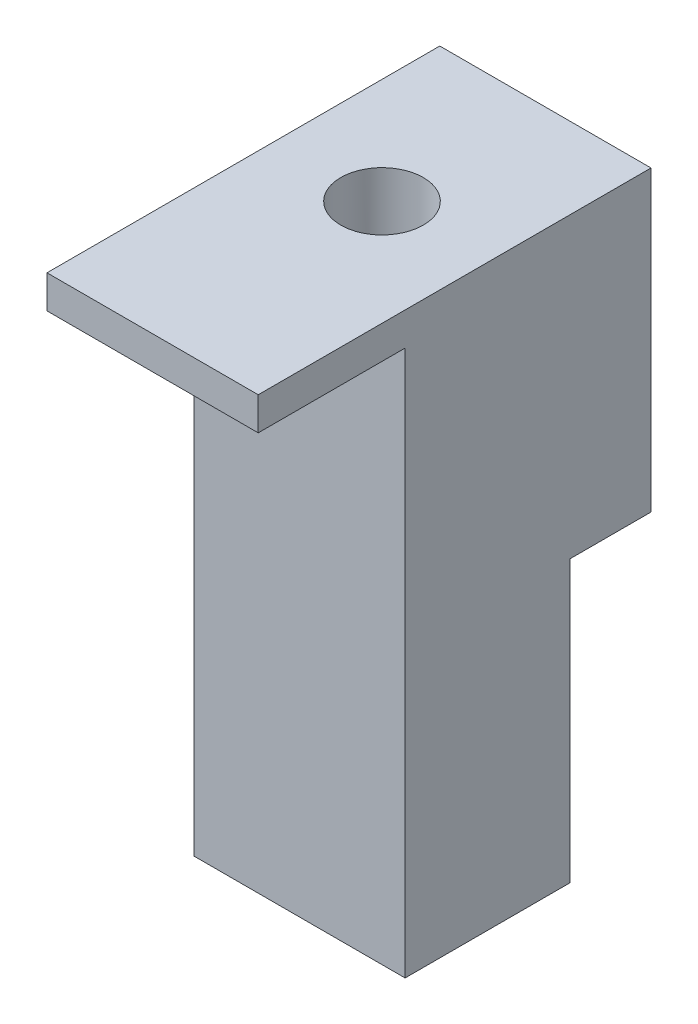
ISO-10303-21;
HEADER;
FILE_DESCRIPTION(('STEP AP214'),'2;1');
FILE_NAME('part.step','',(''),(''),'','','');
FILE_SCHEMA(('AUTOMOTIVE_DESIGN { 1 0 10303 214 1 1 1 1 }'));
ENDSEC;
DATA;
#1=APPLICATION_CONTEXT('core data for automotive mechanical design processes');
#2=APPLICATION_PROTOCOL_DEFINITION('international standard','automotive_design',2000,#1);
#3=PRODUCT_CONTEXT('',#1,'mechanical');
#4=PRODUCT('Part','Part','',(#3));
#5=PRODUCT_RELATED_PRODUCT_CATEGORY('part','',(#4));
#6=PRODUCT_DEFINITION_FORMATION('','',#4);
#7=PRODUCT_DEFINITION_CONTEXT('part definition',#1,'design');
#8=PRODUCT_DEFINITION('design','',#6,#7);
#9=PRODUCT_DEFINITION_SHAPE('','',#8);
#10=(LENGTH_UNIT() NAMED_UNIT(*) SI_UNIT(.MILLI.,.METRE.));
#11=(NAMED_UNIT(*) PLANE_ANGLE_UNIT() SI_UNIT($,.RADIAN.));
#12=(NAMED_UNIT(*) SI_UNIT($,.STERADIAN.) SOLID_ANGLE_UNIT());
#13=UNCERTAINTY_MEASURE_WITH_UNIT(LENGTH_MEASURE(1.E-05),#10,'distance_accuracy_value','');
#14=(GEOMETRIC_REPRESENTATION_CONTEXT(3) GLOBAL_UNCERTAINTY_ASSIGNED_CONTEXT((#13)) GLOBAL_UNIT_ASSIGNED_CONTEXT((#10,
#11,#12)) REPRESENTATION_CONTEXT('',''));
#15=CARTESIAN_POINT('',(0.,0.,0.));
#16=DIRECTION('',(0.,0.,1.));
#17=DIRECTION('',(1.,0.,0.));
#18=AXIS2_PLACEMENT_3D('',#15,#16,#17);
#19=CARTESIAN_POINT('',(138.75,12.9444271909998,15.));
#20=DIRECTION('',(0.,0.,1.));
#21=DIRECTION('',(1.,0.,0.));
#22=AXIS2_PLACEMENT_3D('',#19,#20,#21);
#23=PLANE('',#22);
#24=DIRECTION('',(-1.,0.,0.));
#25=VECTOR('',#24,1.);
#26=CARTESIAN_POINT('',(138.75,33.,15.));
#27=LINE('',#26,#25);
#28=CARTESIAN_POINT('',(138.65,33.,15.));
#29=VERTEX_POINT('',#28);
#30=CARTESIAN_POINT('',(125.85,33.,15.));
#31=VERTEX_POINT('',#30);
#32=EDGE_CURVE('E436',#29,#31,#27,.T.);
#33=ORIENTED_EDGE('',*,*,#32,.T.);
#34=DIRECTION('',(0.,1.,0.));
#35=VECTOR('',#34,1.);
#36=CARTESIAN_POINT('',(125.85,-2.00000000000001,15.));
#37=LINE('',#36,#35);
#38=CARTESIAN_POINT('',(125.85,-0.0555728090001692,15.));
#39=VERTEX_POINT('',#38);
#40=EDGE_CURVE('E237',#39,#31,#37,.T.);
#41=ORIENTED_EDGE('',*,*,#40,.F.);
#42=DIRECTION('',(-1.,0.,0.));
#43=VECTOR('',#42,1.);
#44=CARTESIAN_POINT('',(138.75,-0.0555728090001692,15.));
#45=LINE('',#44,#43);
#46=CARTESIAN_POINT('',(138.65,-0.0555728090001692,15.));
#47=VERTEX_POINT('',#46);
#48=EDGE_CURVE('E311',#47,#39,#45,.T.);
#49=ORIENTED_EDGE('',*,*,#48,.F.);
#50=DIRECTION('',(0.,1.,0.));
#51=VECTOR('',#50,1.);
#52=CARTESIAN_POINT('',(138.65,-2.00000000000001,15.));
#53=LINE('',#52,#51);
#54=EDGE_CURVE('E241',#47,#29,#53,.T.);
#55=ORIENTED_EDGE('',*,*,#54,.T.);
#56=EDGE_LOOP('',(#33,#41,#49,#55));
#57=FACE_BOUND('',#56,.T.);
#58=ADVANCED_FACE('F55',(#57),#23,.T.);
#59=CARTESIAN_POINT('',(132.25,12.9444271909998,10.));
#60=DIRECTION('',(0.,0.,-1.));
#61=DIRECTION('',(-1.,0.,0.));
#62=AXIS2_PLACEMENT_3D('',#59,#60,#61);
#63=CYLINDRICAL_SURFACE('',#62,6.50000000000001);
#64=CARTESIAN_POINT('',(132.25,12.9444271909998,0.0999999999999994));
#65=DIRECTION('',(0.,0.,-1.));
#66=DIRECTION('',(-1.,0.,0.));
#67=AXIS2_PLACEMENT_3D('',#64,#65,#66);
#68=CIRCLE('',#67,6.50000000000001);
#69=CARTESIAN_POINT('',(137.37347538298,16.9444271909998,0.0999999999999994));
#70=VERTEX_POINT('',#69);
#71=CARTESIAN_POINT('',(127.12652461702,16.9444271909998,0.1));
#72=VERTEX_POINT('',#71);
#73=EDGE_CURVE('E240',#70,#72,#68,.F.);
#74=ORIENTED_EDGE('',*,*,#73,.F.);
#75=DIRECTION('',(0.,0.,-1.));
#76=VECTOR('',#75,1.);
#77=CARTESIAN_POINT('',(137.37347538298,16.9444271909998,10.));
#78=LINE('',#77,#76);
#79=CARTESIAN_POINT('',(137.37347538298,16.9444271909998,5.));
#80=VERTEX_POINT('',#79);
#81=EDGE_CURVE('E291',#80,#70,#78,.T.);
#82=ORIENTED_EDGE('',*,*,#81,.F.);
#83=CARTESIAN_POINT('',(132.25,12.9444271909998,5.));
#84=DIRECTION('',(0.,0.,-1.));
#85=DIRECTION('',(-1.,0.,0.));
#86=AXIS2_PLACEMENT_3D('',#83,#84,#85);
#87=CIRCLE('',#86,6.50000000000001);
#88=CARTESIAN_POINT('',(127.12652461702,16.9444271909998,5.));
#89=VERTEX_POINT('',#88);
#90=EDGE_CURVE('E432',#80,#89,#87,.F.);
#91=ORIENTED_EDGE('',*,*,#90,.T.);
#92=DIRECTION('',(0.,0.,-1.));
#93=VECTOR('',#92,1.);
#94=CARTESIAN_POINT('',(127.12652461702,16.9444271909998,10.));
#95=LINE('',#94,#93);
#96=EDGE_CURVE('E295',#72,#89,#95,.F.);
#97=ORIENTED_EDGE('',*,*,#96,.F.);
#98=EDGE_LOOP('',(#74,#82,#91,#97));
#99=FACE_BOUND('',#98,.T.);
#100=ADVANCED_FACE('F481',(#99),#63,.F.);
#101=CARTESIAN_POINT('',(0.,12.9444271909998,5.));
#102=DIRECTION('',(0.,0.,-1.));
#103=DIRECTION('',(-1.,0.,0.));
#104=AXIS2_PLACEMENT_3D('',#101,#102,#103);
#105=PLANE('',#104);
#106=DIRECTION('',(1.,0.,0.));
#107=VECTOR('',#106,1.);
#108=CARTESIAN_POINT('',(125.75,-0.0555728090001692,5.));
#109=LINE('',#108,#107);
#110=CARTESIAN_POINT('',(125.85,-0.0555728090001692,5.));
#111=VERTEX_POINT('',#110);
#112=CARTESIAN_POINT('',(131.,-0.0555728090001692,5.));
#113=VERTEX_POINT('',#112);
#114=EDGE_CURVE('E315',#111,#113,#109,.T.);
#115=ORIENTED_EDGE('',*,*,#114,.F.);
#116=DIRECTION('',(0.,1.,0.));
#117=VECTOR('',#116,1.);
#118=CARTESIAN_POINT('',(125.85,12.9444271909998,5.));
#119=LINE('',#118,#117);
#120=CARTESIAN_POINT('',(125.85,16.9444271909998,5.));
#121=VERTEX_POINT('',#120);
#122=EDGE_CURVE('E252',#111,#121,#119,.T.);
#123=ORIENTED_EDGE('',*,*,#122,.T.);
#124=DIRECTION('',(1.,0.,0.));
#125=VECTOR('',#124,1.);
#126=CARTESIAN_POINT('',(0.,16.9444271909998,5.));
#127=LINE('',#126,#125);
#128=EDGE_CURVE('E288',#121,#89,#127,.T.);
#129=ORIENTED_EDGE('',*,*,#128,.T.);
#130=ORIENTED_EDGE('',*,*,#90,.F.);
#131=CARTESIAN_POINT('',(138.65,16.9444271909998,5.));
#132=VERTEX_POINT('',#131);
#133=EDGE_CURVE('E285',#80,#132,#127,.T.);
#134=ORIENTED_EDGE('',*,*,#133,.T.);
#135=DIRECTION('',(0.,-1.,0.));
#136=VECTOR('',#135,1.);
#137=CARTESIAN_POINT('',(138.65,12.9444271909998,5.));
#138=LINE('',#137,#136);
#139=CARTESIAN_POINT('',(138.65,-0.0555728090001692,5.));
#140=VERTEX_POINT('',#139);
#141=EDGE_CURVE('E260',#132,#140,#138,.T.);
#142=ORIENTED_EDGE('',*,*,#141,.T.);
#143=DIRECTION('',(1.,0.,0.));
#144=VECTOR('',#143,1.);
#145=CARTESIAN_POINT('',(133.5,-0.0555728090001692,5.));
#146=LINE('',#145,#144);
#147=CARTESIAN_POINT('',(133.5,-0.0555728090001692,5.));
#148=VERTEX_POINT('',#147);
#149=EDGE_CURVE('E307',#148,#140,#146,.T.);
#150=ORIENTED_EDGE('',*,*,#149,.F.);
#151=DIRECTION('',(0.,-1.,0.));
#152=VECTOR('',#151,1.);
#153=CARTESIAN_POINT('',(133.5,17.9444271909998,5.));
#154=LINE('',#153,#152);
#155=CARTESIAN_POINT('',(133.5,17.9444271909998,5.));
#156=VERTEX_POINT('',#155);
#157=EDGE_CURVE('E370',#156,#148,#154,.T.);
#158=ORIENTED_EDGE('',*,*,#157,.F.);
#159=DIRECTION('',(1.,0.,0.));
#160=VECTOR('',#159,1.);
#161=CARTESIAN_POINT('',(0.,17.9444271909998,5.));
#162=LINE('',#161,#160);
#163=CARTESIAN_POINT('',(131.,17.9444271909998,5.));
#164=VERTEX_POINT('',#163);
#165=EDGE_CURVE('E359',#164,#156,#162,.T.);
#166=ORIENTED_EDGE('',*,*,#165,.F.);
#167=DIRECTION('',(0.,-1.,0.));
#168=VECTOR('',#167,1.);
#169=CARTESIAN_POINT('',(131.,17.9444271909998,5.));
#170=LINE('',#169,#168);
#171=EDGE_CURVE('E373',#164,#113,#170,.T.);
#172=ORIENTED_EDGE('',*,*,#171,.T.);
#173=EDGE_LOOP('',(#115,#123,#129,#130,#134,#142,#150,#158,#166,#172));
#174=FACE_BOUND('',#173,.T.);
#175=ADVANCED_FACE('F448',(#174),#105,.T.);
#176=CARTESIAN_POINT('',(138.75,35.,10.));
#177=DIRECTION('',(0.,-1.,0.));
#178=DIRECTION('',(0.,0.,-1.));
#179=AXIS2_PLACEMENT_3D('',#176,#177,#178);
#180=PLANE('',#179);
#181=CARTESIAN_POINT('',(132.25,35.,10.));
#182=DIRECTION('',(0.,-1.,0.));
#183=DIRECTION('',(0.,0.,-1.));
#184=AXIS2_PLACEMENT_3D('',#181,#182,#183);
#185=CIRCLE('',#184,2.5);
#186=CARTESIAN_POINT('',(132.25,35.,7.50000000000001));
#187=VERTEX_POINT('',#186);
#188=EDGE_CURVE('E389',#187,#187,#185,.T.);
#189=ORIENTED_EDGE('',*,*,#188,.T.);
#190=EDGE_LOOP('',(#189));
#191=FACE_BOUND('',#190,.T.);
#192=DIRECTION('',(-1.,0.,0.));
#193=VECTOR('',#192,1.);
#194=CARTESIAN_POINT('',(0.,35.,0.1));
#195=LINE('',#194,#193);
#196=CARTESIAN_POINT('',(138.65,35.,0.1));
#197=VERTEX_POINT('',#196);
#198=CARTESIAN_POINT('',(125.85,35.,0.1));
#199=VERTEX_POINT('',#198);
#200=EDGE_CURVE('E226',#197,#199,#195,.T.);
#201=ORIENTED_EDGE('',*,*,#200,.T.);
#202=DIRECTION('',(0.,0.,1.));
#203=VECTOR('',#202,1.);
#204=CARTESIAN_POINT('',(125.85,35.,0.));
#205=LINE('',#204,#203);
#206=CARTESIAN_POINT('',(125.85,35.,23.9));
#207=VERTEX_POINT('',#206);
#208=EDGE_CURVE('E207',#199,#207,#205,.T.);
#209=ORIENTED_EDGE('',*,*,#208,.T.);
#210=DIRECTION('',(1.,0.,0.));
#211=VECTOR('',#210,1.);
#212=CARTESIAN_POINT('',(0.,35.,23.9));
#213=LINE('',#212,#211);
#214=CARTESIAN_POINT('',(138.65,35.,23.9));
#215=VERTEX_POINT('',#214);
#216=EDGE_CURVE('E219',#207,#215,#213,.T.);
#217=ORIENTED_EDGE('',*,*,#216,.T.);
#218=DIRECTION('',(0.,0.,1.));
#219=VECTOR('',#218,1.);
#220=CARTESIAN_POINT('',(138.65,35.,0.));
#221=LINE('',#220,#219);
#222=EDGE_CURVE('E232',#197,#215,#221,.T.);
#223=ORIENTED_EDGE('',*,*,#222,.F.);
#224=EDGE_LOOP('',(#201,#209,#217,#223));
#225=FACE_BOUND('',#224,.T.);
#226=ADVANCED_FACE('F57',(#191,#225),#180,.F.);
#227=CARTESIAN_POINT('',(132.25,-0.0555728090001692,10.));
#228=DIRECTION('',(0.,-1.,0.));
#229=DIRECTION('',(0.,0.,-1.));
#230=AXIS2_PLACEMENT_3D('',#227,#228,#229);
#231=PLANE('',#230);
#232=ORIENTED_EDGE('',*,*,#48,.T.);
#233=DIRECTION('',(0.,0.,-1.));
#234=VECTOR('',#233,1.);
#235=CARTESIAN_POINT('',(125.85,-0.0555728090001692,10.));
#236=LINE('',#235,#234);
#237=EDGE_CURVE('E256',#39,#111,#236,.T.);
#238=ORIENTED_EDGE('',*,*,#237,.T.);
#239=ORIENTED_EDGE('',*,*,#114,.T.);
#240=DIRECTION('',(0.,0.,1.));
#241=VECTOR('',#240,1.);
#242=CARTESIAN_POINT('',(131.,-0.0555728090001692,5.));
#243=LINE('',#242,#241);
#244=CARTESIAN_POINT('',(131.,-0.0555728090001692,7.83493649053891));
#245=VERTEX_POINT('',#244);
#246=EDGE_CURVE('E318',#113,#245,#243,.T.);
#247=ORIENTED_EDGE('',*,*,#246,.T.);
#248=CARTESIAN_POINT('',(132.25,-0.0555728090001692,10.));
#249=DIRECTION('',(0.,1.,0.));
#250=DIRECTION('',(0.,0.,-1.));
#251=AXIS2_PLACEMENT_3D('',#248,#249,#250);
#252=CIRCLE('',#251,2.5);
#253=CARTESIAN_POINT('',(130.25,-0.0555728090001692,8.5));
#254=VERTEX_POINT('',#253);
#255=EDGE_CURVE('E322',#245,#254,#252,.T.);
#256=ORIENTED_EDGE('',*,*,#255,.T.);
#257=DIRECTION('',(-1.,0.,0.));
#258=VECTOR('',#257,1.);
#259=CARTESIAN_POINT('',(130.25,-0.0555728090001692,8.5));
#260=LINE('',#259,#258);
#261=CARTESIAN_POINT('',(127.25,-0.0555728090001692,8.49999999999999));
#262=VERTEX_POINT('',#261);
#263=EDGE_CURVE('E326',#254,#262,#260,.T.);
#264=ORIENTED_EDGE('',*,*,#263,.T.);
#265=DIRECTION('',(0.,0.,1.));
#266=VECTOR('',#265,1.);
#267=CARTESIAN_POINT('',(127.25,-0.0555728090001692,8.49999999999999));
#268=LINE('',#267,#266);
#269=CARTESIAN_POINT('',(127.25,-0.0555728090001692,11.5));
#270=VERTEX_POINT('',#269);
#271=EDGE_CURVE('E330',#262,#270,#268,.T.);
#272=ORIENTED_EDGE('',*,*,#271,.T.);
#273=DIRECTION('',(1.,0.,0.));
#274=VECTOR('',#273,1.);
#275=CARTESIAN_POINT('',(127.25,-0.0555728090001692,11.5));
#276=LINE('',#275,#274);
#277=CARTESIAN_POINT('',(130.25,-0.0555728090001692,11.5));
#278=VERTEX_POINT('',#277);
#279=EDGE_CURVE('E334',#270,#278,#276,.T.);
#280=ORIENTED_EDGE('',*,*,#279,.T.);
#281=CARTESIAN_POINT('',(132.25,-0.0555728090001692,10.));
#282=DIRECTION('',(0.,1.,0.));
#283=DIRECTION('',(0.,0.,-1.));
#284=AXIS2_PLACEMENT_3D('',#281,#282,#283);
#285=CIRCLE('',#284,2.5);
#286=CARTESIAN_POINT('',(134.25,-0.0555728090001692,11.5));
#287=VERTEX_POINT('',#286);
#288=EDGE_CURVE('E338',#278,#287,#285,.T.);
#289=ORIENTED_EDGE('',*,*,#288,.T.);
#290=DIRECTION('',(1.,0.,0.));
#291=VECTOR('',#290,1.);
#292=CARTESIAN_POINT('',(134.25,-0.0555728090001692,11.5));
#293=LINE('',#292,#291);
#294=CARTESIAN_POINT('',(137.25,-0.0555728090001692,11.5));
#295=VERTEX_POINT('',#294);
#296=EDGE_CURVE('E342',#287,#295,#293,.T.);
#297=ORIENTED_EDGE('',*,*,#296,.T.);
#298=DIRECTION('',(0.,0.,-1.));
#299=VECTOR('',#298,1.);
#300=CARTESIAN_POINT('',(137.25,-0.0555728090001692,11.5));
#301=LINE('',#300,#299);
#302=CARTESIAN_POINT('',(137.25,-0.0555728090001692,8.49999999999999));
#303=VERTEX_POINT('',#302);
#304=EDGE_CURVE('E346',#295,#303,#301,.T.);
#305=ORIENTED_EDGE('',*,*,#304,.T.);
#306=DIRECTION('',(-1.,0.,0.));
#307=VECTOR('',#306,1.);
#308=CARTESIAN_POINT('',(137.25,-0.0555728090001692,8.49999999999999));
#309=LINE('',#308,#307);
#310=CARTESIAN_POINT('',(134.25,-0.0555728090001692,8.49999999999999));
#311=VERTEX_POINT('',#310);
#312=EDGE_CURVE('E350',#303,#311,#309,.T.);
#313=ORIENTED_EDGE('',*,*,#312,.T.);
#314=CARTESIAN_POINT('',(132.25,-0.0555728090001692,10.));
#315=DIRECTION('',(0.,1.,0.));
#316=DIRECTION('',(0.,0.,-1.));
#317=AXIS2_PLACEMENT_3D('',#314,#315,#316);
#318=CIRCLE('',#317,2.5);
#319=CARTESIAN_POINT('',(133.5,-0.0555728090001692,7.83493649053891));
#320=VERTEX_POINT('',#319);
#321=EDGE_CURVE('E299',#311,#320,#318,.T.);
#322=ORIENTED_EDGE('',*,*,#321,.T.);
#323=DIRECTION('',(0.,0.,-1.));
#324=VECTOR('',#323,1.);
#325=CARTESIAN_POINT('',(133.5,-0.0555728090001692,7.83493649053891));
#326=LINE('',#325,#324);
#327=EDGE_CURVE('E303',#320,#148,#326,.T.);
#328=ORIENTED_EDGE('',*,*,#327,.T.);
#329=ORIENTED_EDGE('',*,*,#149,.T.);
#330=DIRECTION('',(0.,0.,1.));
#331=VECTOR('',#330,1.);
#332=CARTESIAN_POINT('',(138.65,-0.0555728090001692,10.));
#333=LINE('',#332,#331);
#334=EDGE_CURVE('E220',#140,#47,#333,.T.);
#335=ORIENTED_EDGE('',*,*,#334,.T.);
#336=EDGE_LOOP('',(#232,#238,#239,#247,#256,#264,#272,#280,#289,#297,#305,#313,#322,#328,#329,#335));
#337=FACE_BOUND('',#336,.T.);
#338=ADVANCED_FACE('F453',(#337),#231,.T.);
#339=CARTESIAN_POINT('',(0.,16.9444271909998,0.));
#340=DIRECTION('',(0.,-1.,0.));
#341=DIRECTION('',(0.,0.,-1.));
#342=AXIS2_PLACEMENT_3D('',#339,#340,#341);
#343=PLANE('',#342);
#344=DIRECTION('',(1.,0.,0.));
#345=VECTOR('',#344,1.);
#346=CARTESIAN_POINT('',(0.,16.9444271909998,0.1));
#347=LINE('',#346,#345);
#348=CARTESIAN_POINT('',(138.65,16.9444271909998,0.1));
#349=VERTEX_POINT('',#348);
#350=EDGE_CURVE('E248',#70,#349,#347,.T.);
#351=ORIENTED_EDGE('',*,*,#350,.T.);
#352=DIRECTION('',(0.,0.,1.));
#353=VECTOR('',#352,1.);
#354=CARTESIAN_POINT('',(138.65,16.9444271909998,0.));
#355=LINE('',#354,#353);
#356=EDGE_CURVE('E14',#349,#132,#355,.T.);
#357=ORIENTED_EDGE('',*,*,#356,.T.);
#358=ORIENTED_EDGE('',*,*,#133,.F.);
#359=ORIENTED_EDGE('',*,*,#81,.T.);
#360=EDGE_LOOP('',(#351,#357,#358,#359));
#361=FACE_BOUND('',#360,.T.);
#362=ADVANCED_FACE('F499',(#361),#343,.T.);
#363=ORIENTED_EDGE('',*,*,#128,.F.);
#364=DIRECTION('',(0.,0.,-1.));
#365=VECTOR('',#364,1.);
#366=CARTESIAN_POINT('',(125.85,16.9444271909998,0.));
#367=LINE('',#366,#365);
#368=CARTESIAN_POINT('',(125.85,16.9444271909998,0.1));
#369=VERTEX_POINT('',#368);
#370=EDGE_CURVE('E64',#121,#369,#367,.T.);
#371=ORIENTED_EDGE('',*,*,#370,.T.);
#372=DIRECTION('',(1.,0.,0.));
#373=VECTOR('',#372,1.);
#374=CARTESIAN_POINT('',(0.,16.9444271909998,0.1));
#375=LINE('',#374,#373);
#376=EDGE_CURVE('E228',#369,#72,#375,.T.);
#377=ORIENTED_EDGE('',*,*,#376,.T.);
#378=ORIENTED_EDGE('',*,*,#96,.T.);
#379=EDGE_LOOP('',(#363,#371,#377,#378));
#380=FACE_BOUND('',#379,.T.);
#381=ADVANCED_FACE('F444',(#380),#343,.T.);
#382=CARTESIAN_POINT('',(132.25,35.9444271909998,10.));
#383=DIRECTION('',(0.,-1.,0.));
#384=DIRECTION('',(0.,0.,-1.));
#385=AXIS2_PLACEMENT_3D('',#382,#383,#384);
#386=CYLINDRICAL_SURFACE('',#385,2.5);
#387=ORIENTED_EDGE('',*,*,#188,.F.);
#388=EDGE_LOOP('',(#387));
#389=FACE_BOUND('',#388,.T.);
#390=DIRECTION('',(0.,-1.,0.));
#391=VECTOR('',#390,1.);
#392=CARTESIAN_POINT('',(133.5,17.9444271909998,7.83493649053891));
#393=LINE('',#392,#391);
#394=CARTESIAN_POINT('',(133.5,17.9444271909998,7.83493649053891));
#395=VERTEX_POINT('',#394);
#396=EDGE_CURVE('E366',#395,#320,#393,.T.);
#397=ORIENTED_EDGE('',*,*,#396,.T.);
#398=ORIENTED_EDGE('',*,*,#321,.F.);
#399=DIRECTION('',(0.,-1.,0.));
#400=VECTOR('',#399,1.);
#401=CARTESIAN_POINT('',(134.25,39.2426406871193,8.49999999999999));
#402=LINE('',#401,#400);
#403=CARTESIAN_POINT('',(134.25,30.,8.5));
#404=VERTEX_POINT('',#403);
#405=EDGE_CURVE('E393',#404,#311,#402,.T.);
#406=ORIENTED_EDGE('',*,*,#405,.F.);
#407=CARTESIAN_POINT('',(132.25,30.,9.99999999999999));
#408=DIRECTION('',(0.,-1.,0.));
#409=DIRECTION('',(0.,0.,-1.));
#410=AXIS2_PLACEMENT_3D('',#407,#408,#409);
#411=CIRCLE('',#410,2.5);
#412=CARTESIAN_POINT('',(134.25,30.,11.5));
#413=VERTEX_POINT('',#412);
#414=EDGE_CURVE('E379',#404,#413,#411,.T.);
#415=ORIENTED_EDGE('',*,*,#414,.T.);
#416=DIRECTION('',(0.,-1.,0.));
#417=VECTOR('',#416,1.);
#418=CARTESIAN_POINT('',(134.25,39.2426406871193,11.5));
#419=LINE('',#418,#417);
#420=EDGE_CURVE('E396',#413,#287,#419,.T.);
#421=ORIENTED_EDGE('',*,*,#420,.T.);
#422=ORIENTED_EDGE('',*,*,#288,.F.);
#423=DIRECTION('',(0.,-1.,0.));
#424=VECTOR('',#423,1.);
#425=CARTESIAN_POINT('',(130.25,39.2426406871193,11.5));
#426=LINE('',#425,#424);
#427=CARTESIAN_POINT('',(130.25,30.,11.5));
#428=VERTEX_POINT('',#427);
#429=EDGE_CURVE('E409',#428,#278,#426,.T.);
#430=ORIENTED_EDGE('',*,*,#429,.F.);
#431=CARTESIAN_POINT('',(132.25,30.,9.99999999999999));
#432=DIRECTION('',(0.,-1.,0.));
#433=DIRECTION('',(0.,0.,-1.));
#434=AXIS2_PLACEMENT_3D('',#431,#432,#433);
#435=CIRCLE('',#434,2.5);
#436=CARTESIAN_POINT('',(130.25,30.,8.5));
#437=VERTEX_POINT('',#436);
#438=EDGE_CURVE('E408',#428,#437,#435,.T.);
#439=ORIENTED_EDGE('',*,*,#438,.T.);
#440=DIRECTION('',(0.,-1.,0.));
#441=VECTOR('',#440,1.);
#442=CARTESIAN_POINT('',(130.25,39.2426406871193,8.49999999999999));
#443=LINE('',#442,#441);
#444=EDGE_CURVE('E419',#437,#254,#443,.T.);
#445=ORIENTED_EDGE('',*,*,#444,.T.);
#446=ORIENTED_EDGE('',*,*,#255,.F.);
#447=DIRECTION('',(0.,-1.,0.));
#448=VECTOR('',#447,1.);
#449=CARTESIAN_POINT('',(131.,17.9444271909998,7.83493649053891));
#450=LINE('',#449,#448);
#451=CARTESIAN_POINT('',(131.,17.9444271909998,7.83493649053891));
#452=VERTEX_POINT('',#451);
#453=EDGE_CURVE('E365',#452,#245,#450,.T.);
#454=ORIENTED_EDGE('',*,*,#453,.F.);
#455=CARTESIAN_POINT('',(132.25,17.9444271909998,10.));
#456=DIRECTION('',(0.,-1.,0.));
#457=DIRECTION('',(0.,0.,-1.));
#458=AXIS2_PLACEMENT_3D('',#455,#456,#457);
#459=CIRCLE('',#458,2.5);
#460=EDGE_CURVE('E354',#395,#452,#459,.F.);
#461=ORIENTED_EDGE('',*,*,#460,.F.);
#462=EDGE_LOOP('',(#397,#398,#406,#415,#421,#422,#430,#439,#445,#446,#454,#461));
#463=FACE_BOUND('',#462,.T.);
#464=ADVANCED_FACE('F489',(#389,#463),#386,.F.);
#465=CARTESIAN_POINT('',(0.,39.2426406871193,11.5));
#466=DIRECTION('',(0.,0.,-1.));
#467=DIRECTION('',(-1.,0.,0.));
#468=AXIS2_PLACEMENT_3D('',#465,#466,#467);
#469=PLANE('',#468);
#470=ORIENTED_EDGE('',*,*,#429,.T.);
#471=ORIENTED_EDGE('',*,*,#279,.F.);
#472=DIRECTION('',(0.,-1.,0.));
#473=VECTOR('',#472,1.);
#474=CARTESIAN_POINT('',(127.25,39.2426406871193,11.5));
#475=LINE('',#474,#473);
#476=CARTESIAN_POINT('',(127.25,30.,11.5));
#477=VERTEX_POINT('',#476);
#478=EDGE_CURVE('E369',#477,#270,#475,.T.);
#479=ORIENTED_EDGE('',*,*,#478,.F.);
#480=DIRECTION('',(-1.,0.,0.));
#481=VECTOR('',#480,1.);
#482=CARTESIAN_POINT('',(0.,30.,11.5));
#483=LINE('',#482,#481);
#484=EDGE_CURVE('E413',#428,#477,#483,.T.);
#485=ORIENTED_EDGE('',*,*,#484,.F.);
#486=EDGE_LOOP('',(#470,#471,#479,#485));
#487=FACE_BOUND('',#486,.T.);
#488=ADVANCED_FACE('F505',(#487),#469,.T.);
#489=CARTESIAN_POINT('',(0.,39.2426406871193,8.49999999999999));
#490=DIRECTION('',(0.,0.,-1.));
#491=DIRECTION('',(-1.,0.,0.));
#492=AXIS2_PLACEMENT_3D('',#489,#490,#491);
#493=PLANE('',#492);
#494=DIRECTION('',(-1.,0.,0.));
#495=VECTOR('',#494,1.);
#496=CARTESIAN_POINT('',(0.,30.,8.49999999999999));
#497=LINE('',#496,#495);
#498=CARTESIAN_POINT('',(127.25,30.,8.49999999999999));
#499=VERTEX_POINT('',#498);
#500=EDGE_CURVE('E405',#437,#499,#497,.T.);
#501=ORIENTED_EDGE('',*,*,#500,.T.);
#502=DIRECTION('',(0.,-1.,0.));
#503=VECTOR('',#502,1.);
#504=CARTESIAN_POINT('',(127.25,39.2426406871193,8.49999999999999));
#505=LINE('',#504,#503);
#506=EDGE_CURVE('E422',#499,#262,#505,.T.);
#507=ORIENTED_EDGE('',*,*,#506,.T.);
#508=ORIENTED_EDGE('',*,*,#263,.F.);
#509=ORIENTED_EDGE('',*,*,#444,.F.);
#510=EDGE_LOOP('',(#501,#507,#508,#509));
#511=FACE_BOUND('',#510,.T.);
#512=ADVANCED_FACE('F541',(#511),#493,.F.);
#513=CARTESIAN_POINT('',(127.25,39.2426406871193,0.));
#514=DIRECTION('',(-1.,0.,0.));
#515=DIRECTION('',(0.,0.,1.));
#516=AXIS2_PLACEMENT_3D('',#513,#514,#515);
#517=PLANE('',#516);
#518=DIRECTION('',(0.,0.,1.));
#519=VECTOR('',#518,1.);
#520=CARTESIAN_POINT('',(127.25,30.,0.));
#521=LINE('',#520,#519);
#522=EDGE_CURVE('E402',#499,#477,#521,.T.);
#523=ORIENTED_EDGE('',*,*,#522,.T.);
#524=ORIENTED_EDGE('',*,*,#478,.T.);
#525=ORIENTED_EDGE('',*,*,#271,.F.);
#526=ORIENTED_EDGE('',*,*,#506,.F.);
#527=EDGE_LOOP('',(#523,#524,#525,#526));
#528=FACE_BOUND('',#527,.T.);
#529=ADVANCED_FACE('F545',(#528),#517,.F.);
#530=CARTESIAN_POINT('',(138.75,30.,10.));
#531=DIRECTION('',(0.,-1.,0.));
#532=DIRECTION('',(0.,0.,-1.));
#533=AXIS2_PLACEMENT_3D('',#530,#531,#532);
#534=PLANE('',#533);
#535=ORIENTED_EDGE('',*,*,#438,.F.);
#536=ORIENTED_EDGE('',*,*,#484,.T.);
#537=ORIENTED_EDGE('',*,*,#522,.F.);
#538=ORIENTED_EDGE('',*,*,#500,.F.);
#539=EDGE_LOOP('',(#535,#536,#537,#538));
#540=FACE_BOUND('',#539,.T.);
#541=ADVANCED_FACE('F538',(#540),#534,.T.);
#542=CARTESIAN_POINT('',(0.,39.2426406871193,11.5));
#543=DIRECTION('',(0.,0.,-1.));
#544=DIRECTION('',(-1.,0.,0.));
#545=AXIS2_PLACEMENT_3D('',#542,#543,#544);
#546=PLANE('',#545);
#547=DIRECTION('',(0.,-1.,0.));
#548=VECTOR('',#547,1.);
#549=CARTESIAN_POINT('',(137.25,39.2426406871193,11.5));
#550=LINE('',#549,#548);
#551=CARTESIAN_POINT('',(137.25,30.,11.5));
#552=VERTEX_POINT('',#551);
#553=EDGE_CURVE('E399',#552,#295,#550,.T.);
#554=ORIENTED_EDGE('',*,*,#553,.T.);
#555=ORIENTED_EDGE('',*,*,#296,.F.);
#556=ORIENTED_EDGE('',*,*,#420,.F.);
#557=DIRECTION('',(-1.,0.,0.));
#558=VECTOR('',#557,1.);
#559=CARTESIAN_POINT('',(0.,30.,11.5));
#560=LINE('',#559,#558);
#561=EDGE_CURVE('E79',#552,#413,#560,.T.);
#562=ORIENTED_EDGE('',*,*,#561,.F.);
#563=EDGE_LOOP('',(#554,#555,#556,#562));
#564=FACE_BOUND('',#563,.T.);
#565=ADVANCED_FACE('F529',(#564),#546,.T.);
#566=CARTESIAN_POINT('',(0.,39.2426406871193,8.49999999999999));
#567=DIRECTION('',(0.,0.,-1.));
#568=DIRECTION('',(-1.,0.,0.));
#569=AXIS2_PLACEMENT_3D('',#566,#567,#568);
#570=PLANE('',#569);
#571=DIRECTION('',(-1.,0.,0.));
#572=VECTOR('',#571,1.);
#573=CARTESIAN_POINT('',(0.,30.,8.49999999999999));
#574=LINE('',#573,#572);
#575=CARTESIAN_POINT('',(137.25,30.,8.49999999999999));
#576=VERTEX_POINT('',#575);
#577=EDGE_CURVE('E383',#576,#404,#574,.T.);
#578=ORIENTED_EDGE('',*,*,#577,.T.);
#579=ORIENTED_EDGE('',*,*,#405,.T.);
#580=ORIENTED_EDGE('',*,*,#312,.F.);
#581=DIRECTION('',(0.,-1.,0.));
#582=VECTOR('',#581,1.);
#583=CARTESIAN_POINT('',(137.25,39.2426406871193,8.49999999999999));
#584=LINE('',#583,#582);
#585=EDGE_CURVE('E390',#576,#303,#584,.T.);
#586=ORIENTED_EDGE('',*,*,#585,.F.);
#587=EDGE_LOOP('',(#578,#579,#580,#586));
#588=FACE_BOUND('',#587,.T.);
#589=ADVANCED_FACE('F520',(#588),#570,.F.);
#590=CARTESIAN_POINT('',(137.25,39.2426406871193,0.));
#591=DIRECTION('',(-1.,0.,0.));
#592=DIRECTION('',(0.,0.,1.));
#593=AXIS2_PLACEMENT_3D('',#590,#591,#592);
#594=PLANE('',#593);
#595=ORIENTED_EDGE('',*,*,#585,.T.);
#596=ORIENTED_EDGE('',*,*,#304,.F.);
#597=ORIENTED_EDGE('',*,*,#553,.F.);
#598=DIRECTION('',(0.,0.,1.));
#599=VECTOR('',#598,1.);
#600=CARTESIAN_POINT('',(137.25,30.,0.));
#601=LINE('',#600,#599);
#602=EDGE_CURVE('E386',#576,#552,#601,.T.);
#603=ORIENTED_EDGE('',*,*,#602,.F.);
#604=EDGE_LOOP('',(#595,#596,#597,#603));
#605=FACE_BOUND('',#604,.T.);
#606=ADVANCED_FACE('F526',(#605),#594,.T.);
#607=CARTESIAN_POINT('',(138.75,30.,10.));
#608=DIRECTION('',(0.,-1.,0.));
#609=DIRECTION('',(0.,0.,-1.));
#610=AXIS2_PLACEMENT_3D('',#607,#608,#609);
#611=PLANE('',#610);
#612=ORIENTED_EDGE('',*,*,#577,.F.);
#613=ORIENTED_EDGE('',*,*,#602,.T.);
#614=ORIENTED_EDGE('',*,*,#561,.T.);
#615=ORIENTED_EDGE('',*,*,#414,.F.);
#616=EDGE_LOOP('',(#612,#613,#614,#615));
#617=FACE_BOUND('',#616,.T.);
#618=ADVANCED_FACE('F523',(#617),#611,.T.);
#619=CARTESIAN_POINT('',(133.5,17.9444271909998,0.));
#620=DIRECTION('',(-1.,0.,0.));
#621=DIRECTION('',(0.,0.,1.));
#622=AXIS2_PLACEMENT_3D('',#619,#620,#621);
#623=PLANE('',#622);
#624=ORIENTED_EDGE('',*,*,#157,.T.);
#625=ORIENTED_EDGE('',*,*,#327,.F.);
#626=ORIENTED_EDGE('',*,*,#396,.F.);
#627=DIRECTION('',(0.,0.,-1.));
#628=VECTOR('',#627,1.);
#629=CARTESIAN_POINT('',(133.5,17.9444271909998,0.));
#630=LINE('',#629,#628);
#631=EDGE_CURVE('E362',#395,#156,#630,.T.);
#632=ORIENTED_EDGE('',*,*,#631,.T.);
#633=EDGE_LOOP('',(#624,#625,#626,#632));
#634=FACE_BOUND('',#633,.T.);
#635=ADVANCED_FACE('F513',(#634),#623,.T.);
#636=CARTESIAN_POINT('',(131.,17.9444271909998,0.));
#637=DIRECTION('',(-1.,0.,0.));
#638=DIRECTION('',(0.,0.,1.));
#639=AXIS2_PLACEMENT_3D('',#636,#637,#638);
#640=PLANE('',#639);
#641=ORIENTED_EDGE('',*,*,#453,.T.);
#642=ORIENTED_EDGE('',*,*,#246,.F.);
#643=ORIENTED_EDGE('',*,*,#171,.F.);
#644=DIRECTION('',(0.,0.,-1.));
#645=VECTOR('',#644,1.);
#646=CARTESIAN_POINT('',(131.,17.9444271909998,0.));
#647=LINE('',#646,#645);
#648=EDGE_CURVE('E71',#452,#164,#647,.T.);
#649=ORIENTED_EDGE('',*,*,#648,.F.);
#650=EDGE_LOOP('',(#641,#642,#643,#649));
#651=FACE_BOUND('',#650,.T.);
#652=ADVANCED_FACE('F547',(#651),#640,.F.);
#653=CARTESIAN_POINT('',(0.,17.9444271909998,0.));
#654=DIRECTION('',(0.,-1.,0.));
#655=DIRECTION('',(0.,0.,-1.));
#656=AXIS2_PLACEMENT_3D('',#653,#654,#655);
#657=PLANE('',#656);
#658=ORIENTED_EDGE('',*,*,#460,.T.);
#659=ORIENTED_EDGE('',*,*,#648,.T.);
#660=ORIENTED_EDGE('',*,*,#165,.T.);
#661=ORIENTED_EDGE('',*,*,#631,.F.);
#662=EDGE_LOOP('',(#658,#659,#660,#661));
#663=FACE_BOUND('',#662,.T.);
#664=ADVANCED_FACE('F478',(#663),#657,.T.);
#665=CARTESIAN_POINT('',(138.65,33.,0.));
#666=DIRECTION('',(-1.,0.,0.));
#667=DIRECTION('',(0.,0.,1.));
#668=AXIS2_PLACEMENT_3D('',#665,#666,#667);
#669=PLANE('',#668);
#670=DIRECTION('',(0.,0.,1.));
#671=VECTOR('',#670,1.);
#672=CARTESIAN_POINT('',(138.65,33.,0.));
#673=LINE('',#672,#671);
#674=CARTESIAN_POINT('',(138.65,33.,23.9));
#675=VERTEX_POINT('',#674);
#676=EDGE_CURVE('E274',#29,#675,#673,.T.);
#677=ORIENTED_EDGE('',*,*,#676,.F.);
#678=ORIENTED_EDGE('',*,*,#54,.F.);
#679=ORIENTED_EDGE('',*,*,#334,.F.);
#680=ORIENTED_EDGE('',*,*,#141,.F.);
#681=ORIENTED_EDGE('',*,*,#356,.F.);
#682=DIRECTION('',(0.,1.,0.));
#683=VECTOR('',#682,1.);
#684=CARTESIAN_POINT('',(138.65,-2.00000000000001,0.1));
#685=LINE('',#684,#683);
#686=EDGE_CURVE('E230',#349,#197,#685,.T.);
#687=ORIENTED_EDGE('',*,*,#686,.T.);
#688=ORIENTED_EDGE('',*,*,#222,.T.);
#689=DIRECTION('',(0.,1.,0.));
#690=VECTOR('',#689,1.);
#691=CARTESIAN_POINT('',(138.65,33.,23.9));
#692=LINE('',#691,#690);
#693=EDGE_CURVE('E281',#675,#215,#692,.T.);
#694=ORIENTED_EDGE('',*,*,#693,.F.);
#695=EDGE_LOOP('',(#677,#678,#679,#680,#681,#687,#688,#694));
#696=FACE_BOUND('',#695,.T.);
#697=ADVANCED_FACE('F466',(#696),#669,.F.);
#698=CARTESIAN_POINT('',(0.,33.,23.9));
#699=DIRECTION('',(0.,0.,1.));
#700=DIRECTION('',(1.,0.,0.));
#701=AXIS2_PLACEMENT_3D('',#698,#699,#700);
#702=PLANE('',#701);
#703=ORIENTED_EDGE('',*,*,#216,.F.);
#704=DIRECTION('',(0.,1.,0.));
#705=VECTOR('',#704,1.);
#706=CARTESIAN_POINT('',(125.85,33.,23.9));
#707=LINE('',#706,#705);
#708=CARTESIAN_POINT('',(125.85,33.,23.9));
#709=VERTEX_POINT('',#708);
#710=EDGE_CURVE('E213',#709,#207,#707,.T.);
#711=ORIENTED_EDGE('',*,*,#710,.F.);
#712=DIRECTION('',(1.,0.,0.));
#713=VECTOR('',#712,1.);
#714=CARTESIAN_POINT('',(0.,33.,23.9));
#715=LINE('',#714,#713);
#716=EDGE_CURVE('E270',#709,#675,#715,.T.);
#717=ORIENTED_EDGE('',*,*,#716,.T.);
#718=ORIENTED_EDGE('',*,*,#693,.T.);
#719=EDGE_LOOP('',(#703,#711,#717,#718));
#720=FACE_BOUND('',#719,.T.);
#721=ADVANCED_FACE('F468',(#720),#702,.T.);
#722=CARTESIAN_POINT('',(125.85,33.,0.));
#723=DIRECTION('',(-1.,0.,0.));
#724=DIRECTION('',(0.,0.,1.));
#725=AXIS2_PLACEMENT_3D('',#722,#723,#724);
#726=PLANE('',#725);
#727=ORIENTED_EDGE('',*,*,#208,.F.);
#728=DIRECTION('',(0.,1.,0.));
#729=VECTOR('',#728,1.);
#730=CARTESIAN_POINT('',(125.85,-2.00000000000001,0.1));
#731=LINE('',#730,#729);
#732=EDGE_CURVE('E210',#369,#199,#731,.T.);
#733=ORIENTED_EDGE('',*,*,#732,.F.);
#734=ORIENTED_EDGE('',*,*,#370,.F.);
#735=ORIENTED_EDGE('',*,*,#122,.F.);
#736=ORIENTED_EDGE('',*,*,#237,.F.);
#737=ORIENTED_EDGE('',*,*,#40,.T.);
#738=DIRECTION('',(0.,0.,1.));
#739=VECTOR('',#738,1.);
#740=CARTESIAN_POINT('',(125.85,33.,0.));
#741=LINE('',#740,#739);
#742=EDGE_CURVE('E267',#31,#709,#741,.T.);
#743=ORIENTED_EDGE('',*,*,#742,.T.);
#744=ORIENTED_EDGE('',*,*,#710,.T.);
#745=EDGE_LOOP('',(#727,#733,#734,#735,#736,#737,#743,#744));
#746=FACE_BOUND('',#745,.T.);
#747=ADVANCED_FACE('F209',(#746),#726,.T.);
#748=CARTESIAN_POINT('',(0.,33.,0.));
#749=DIRECTION('',(0.,1.,0.));
#750=DIRECTION('',(0.,0.,1.));
#751=AXIS2_PLACEMENT_3D('',#748,#749,#750);
#752=PLANE('',#751);
#753=ORIENTED_EDGE('',*,*,#32,.F.);
#754=ORIENTED_EDGE('',*,*,#676,.T.);
#755=ORIENTED_EDGE('',*,*,#716,.F.);
#756=ORIENTED_EDGE('',*,*,#742,.F.);
#757=EDGE_LOOP('',(#753,#754,#755,#756));
#758=FACE_BOUND('',#757,.T.);
#759=ADVANCED_FACE('F462',(#758),#752,.F.);
#760=CARTESIAN_POINT('',(0.,-2.00000000000001,0.1));
#761=DIRECTION('',(0.,0.,-1.));
#762=DIRECTION('',(-1.,0.,0.));
#763=AXIS2_PLACEMENT_3D('',#760,#761,#762);
#764=PLANE('',#763);
#765=ORIENTED_EDGE('',*,*,#73,.T.);
#766=ORIENTED_EDGE('',*,*,#376,.F.);
#767=ORIENTED_EDGE('',*,*,#732,.T.);
#768=ORIENTED_EDGE('',*,*,#200,.F.);
#769=ORIENTED_EDGE('',*,*,#686,.F.);
#770=ORIENTED_EDGE('',*,*,#350,.F.);
#771=EDGE_LOOP('',(#765,#766,#767,#768,#769,#770));
#772=FACE_BOUND('',#771,.T.);
#773=ADVANCED_FACE('F224',(#772),#764,.T.);
#774=CLOSED_SHELL('',(#58,#100,#175,#226,#338,#362,#381,#464,#488,#512,#529,#541,#565,#589,#606,
#618,#635,#652,#664,#697,#721,#747,#759,#773));
#775=MANIFOLD_SOLID_BREP('B2',#774);
#776=ADVANCED_BREP_SHAPE_REPRESENTATION('',(#18,#775),#14);
#777=SHAPE_DEFINITION_REPRESENTATION(#9,#776);
ENDSEC;
END-ISO-10303-21;
